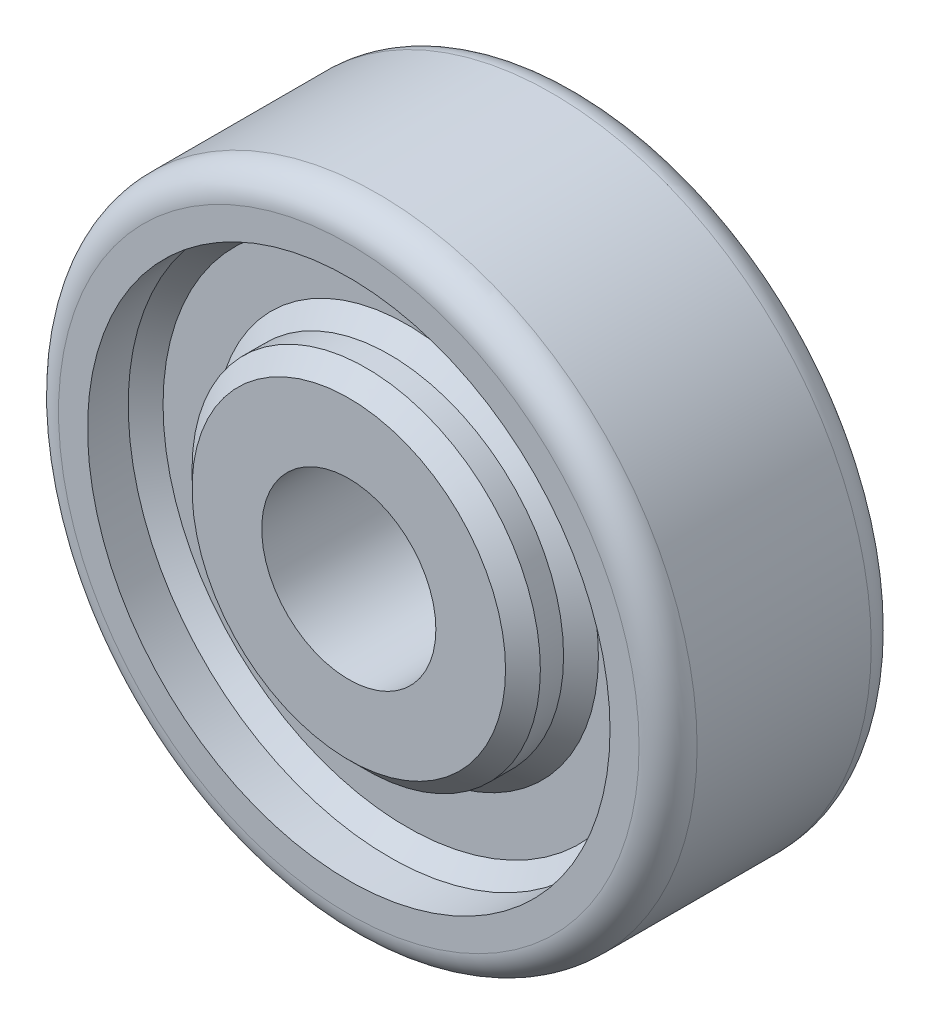
ISO-10303-21;
HEADER;
FILE_DESCRIPTION(('STEP AP214'),'2;1');
FILE_NAME('part.step','',(''),(''),'','','');
FILE_SCHEMA(('AUTOMOTIVE_DESIGN { 1 0 10303 214 1 1 1 1 }'));
ENDSEC;
DATA;
#1=APPLICATION_CONTEXT('core data for automotive mechanical design processes');
#2=APPLICATION_PROTOCOL_DEFINITION('international standard','automotive_design',2000,#1);
#3=PRODUCT_CONTEXT('',#1,'mechanical');
#4=PRODUCT('Part','Part','',(#3));
#5=PRODUCT_RELATED_PRODUCT_CATEGORY('part','',(#4));
#6=PRODUCT_DEFINITION_FORMATION('','',#4);
#7=PRODUCT_DEFINITION_CONTEXT('part definition',#1,'design');
#8=PRODUCT_DEFINITION('design','',#6,#7);
#9=PRODUCT_DEFINITION_SHAPE('','',#8);
#10=(LENGTH_UNIT() NAMED_UNIT(*) SI_UNIT(.MILLI.,.METRE.));
#11=(NAMED_UNIT(*) PLANE_ANGLE_UNIT() SI_UNIT($,.RADIAN.));
#12=(NAMED_UNIT(*) SI_UNIT($,.STERADIAN.) SOLID_ANGLE_UNIT());
#13=UNCERTAINTY_MEASURE_WITH_UNIT(LENGTH_MEASURE(1.E-05),#10,'distance_accuracy_value','');
#14=(GEOMETRIC_REPRESENTATION_CONTEXT(3) GLOBAL_UNCERTAINTY_ASSIGNED_CONTEXT((#13)) GLOBAL_UNIT_ASSIGNED_CONTEXT((#10,
#11,#12)) REPRESENTATION_CONTEXT('',''));
#15=CARTESIAN_POINT('',(0.,0.,0.));
#16=DIRECTION('',(0.,0.,1.));
#17=DIRECTION('',(1.,0.,0.));
#18=AXIS2_PLACEMENT_3D('',#15,#16,#17);
#19=CARTESIAN_POINT('',(0.,0.,20.));
#20=DIRECTION('',(0.,0.,-1.));
#21=DIRECTION('',(-1.,0.,0.));
#22=AXIS2_PLACEMENT_3D('',#19,#20,#21);
#23=CYLINDRICAL_SURFACE('',#22,55.);
#24=CARTESIAN_POINT('',(0.,0.,-15.));
#25=DIRECTION('',(0.,0.,1.));
#26=DIRECTION('',(1.,0.,0.));
#27=AXIS2_PLACEMENT_3D('',#24,#25,#26);
#28=CIRCLE('',#27,55.);
#29=CARTESIAN_POINT('',(55.,0.,-15.));
#30=VERTEX_POINT('',#29);
#31=EDGE_CURVE('E100',#30,#30,#28,.T.);
#32=ORIENTED_EDGE('',*,*,#31,.T.);
#33=EDGE_LOOP('',(#32));
#34=FACE_BOUND('',#33,.T.);
#35=CARTESIAN_POINT('',(0.,0.,15.));
#36=DIRECTION('',(0.,0.,1.));
#37=DIRECTION('',(1.,0.,0.));
#38=AXIS2_PLACEMENT_3D('',#35,#36,#37);
#39=CIRCLE('',#38,55.);
#40=CARTESIAN_POINT('',(55.,0.,15.));
#41=VERTEX_POINT('',#40);
#42=EDGE_CURVE('E104',#41,#41,#39,.F.);
#43=ORIENTED_EDGE('',*,*,#42,.T.);
#44=EDGE_LOOP('',(#43));
#45=FACE_BOUND('',#44,.T.);
#46=ADVANCED_FACE('F51',(#34,#45),#23,.T.);
#47=CARTESIAN_POINT('',(0.,0.,20.));
#48=DIRECTION('',(0.,0.,1.));
#49=DIRECTION('',(1.,0.,0.));
#50=AXIS2_PLACEMENT_3D('',#47,#48,#49);
#51=PLANE('',#50);
#52=CARTESIAN_POINT('',(0.,0.,20.));
#53=DIRECTION('',(0.,0.,1.));
#54=DIRECTION('',(1.,0.,0.));
#55=AXIS2_PLACEMENT_3D('',#52,#53,#54);
#56=CIRCLE('',#55,50.);
#57=CARTESIAN_POINT('',(50.,0.,20.));
#58=VERTEX_POINT('',#57);
#59=EDGE_CURVE('E92',#58,#58,#56,.T.);
#60=ORIENTED_EDGE('',*,*,#59,.T.);
#61=EDGE_LOOP('',(#60));
#62=FACE_BOUND('',#61,.T.);
#63=CARTESIAN_POINT('',(0.,0.,20.));
#64=DIRECTION('',(0.,0.,1.));
#65=DIRECTION('',(1.,0.,0.));
#66=AXIS2_PLACEMENT_3D('',#63,#64,#65);
#67=CIRCLE('',#66,45.);
#68=CARTESIAN_POINT('',(45.,0.,20.));
#69=VERTEX_POINT('',#68);
#70=EDGE_CURVE('E108',#69,#69,#67,.T.);
#71=ORIENTED_EDGE('',*,*,#70,.F.);
#72=EDGE_LOOP('',(#71));
#73=FACE_BOUND('',#72,.T.);
#74=ADVANCED_FACE('F141',(#62,#73),#51,.T.);
#75=CARTESIAN_POINT('',(0.,0.,-20.));
#76=DIRECTION('',(0.,0.,1.));
#77=DIRECTION('',(1.,0.,0.));
#78=AXIS2_PLACEMENT_3D('',#75,#76,#77);
#79=PLANE('',#78);
#80=CARTESIAN_POINT('',(0.,0.,-20.));
#81=DIRECTION('',(0.,0.,1.));
#82=DIRECTION('',(1.,0.,0.));
#83=AXIS2_PLACEMENT_3D('',#80,#81,#82);
#84=CIRCLE('',#83,50.);
#85=CARTESIAN_POINT('',(50.,0.,-20.));
#86=VERTEX_POINT('',#85);
#87=EDGE_CURVE('E96',#86,#86,#84,.F.);
#88=ORIENTED_EDGE('',*,*,#87,.T.);
#89=EDGE_LOOP('',(#88));
#90=FACE_BOUND('',#89,.T.);
#91=CARTESIAN_POINT('',(0.,0.,-20.));
#92=DIRECTION('',(0.,0.,1.));
#93=DIRECTION('',(1.,0.,0.));
#94=AXIS2_PLACEMENT_3D('',#91,#92,#93);
#95=CIRCLE('',#94,45.);
#96=CARTESIAN_POINT('',(45.,0.,-20.));
#97=VERTEX_POINT('',#96);
#98=EDGE_CURVE('E119',#97,#97,#95,.T.);
#99=ORIENTED_EDGE('',*,*,#98,.T.);
#100=EDGE_LOOP('',(#99));
#101=FACE_BOUND('',#100,.T.);
#102=ADVANCED_FACE('F154',(#90,#101),#79,.F.);
#103=CARTESIAN_POINT('',(0.,0.,10.));
#104=DIRECTION('',(0.,0.,1.));
#105=DIRECTION('',(1.,0.,0.));
#106=AXIS2_PLACEMENT_3D('',#103,#104,#105);
#107=CYLINDRICAL_SURFACE('',#106,45.);
#108=CARTESIAN_POINT('',(0.,0.,13.));
#109=DIRECTION('',(0.,0.,1.));
#110=DIRECTION('',(1.,0.,0.));
#111=AXIS2_PLACEMENT_3D('',#108,#109,#110);
#112=CIRCLE('',#111,45.);
#113=CARTESIAN_POINT('',(45.,0.,13.));
#114=VERTEX_POINT('',#113);
#115=EDGE_CURVE('E70',#114,#114,#112,.F.);
#116=ORIENTED_EDGE('',*,*,#115,.T.);
#117=EDGE_LOOP('',(#116));
#118=FACE_BOUND('',#117,.T.);
#119=ORIENTED_EDGE('',*,*,#70,.T.);
#120=EDGE_LOOP('',(#119));
#121=FACE_BOUND('',#120,.T.);
#122=ADVANCED_FACE('F198',(#118,#121),#107,.F.);
#123=CARTESIAN_POINT('',(0.,0.,10.));
#124=DIRECTION('',(0.,0.,1.));
#125=DIRECTION('',(1.,0.,0.));
#126=AXIS2_PLACEMENT_3D('',#123,#124,#125);
#127=PLANE('',#126);
#128=CARTESIAN_POINT('',(0.,0.,10.));
#129=DIRECTION('',(0.,0.,1.));
#130=DIRECTION('',(1.,0.,0.));
#131=AXIS2_PLACEMENT_3D('',#128,#129,#130);
#132=CIRCLE('',#131,42.);
#133=CARTESIAN_POINT('',(42.,0.,10.));
#134=VERTEX_POINT('',#133);
#135=EDGE_CURVE('E76',#134,#134,#132,.T.);
#136=ORIENTED_EDGE('',*,*,#135,.T.);
#137=EDGE_LOOP('',(#136));
#138=FACE_BOUND('',#137,.T.);
#139=CARTESIAN_POINT('',(0.,0.,10.));
#140=DIRECTION('',(0.,0.,1.));
#141=DIRECTION('',(1.,0.,0.));
#142=AXIS2_PLACEMENT_3D('',#139,#140,#141);
#143=CIRCLE('',#142,33.);
#144=CARTESIAN_POINT('',(33.,0.,10.));
#145=VERTEX_POINT('',#144);
#146=EDGE_CURVE('E80',#145,#145,#143,.F.);
#147=ORIENTED_EDGE('',*,*,#146,.T.);
#148=EDGE_LOOP('',(#147));
#149=FACE_BOUND('',#148,.T.);
#150=ADVANCED_FACE('F149',(#138,#149),#127,.T.);
#151=CARTESIAN_POINT('',(0.,0.,10.));
#152=DIRECTION('',(0.,0.,1.));
#153=DIRECTION('',(1.,0.,0.));
#154=AXIS2_PLACEMENT_3D('',#151,#152,#153);
#155=CYLINDRICAL_SURFACE('',#154,30.);
#156=CARTESIAN_POINT('',(0.,0.,13.));
#157=DIRECTION('',(0.,0.,1.));
#158=DIRECTION('',(1.,0.,0.));
#159=AXIS2_PLACEMENT_3D('',#156,#157,#158);
#160=CIRCLE('',#159,30.);
#161=CARTESIAN_POINT('',(30.,0.,13.));
#162=VERTEX_POINT('',#161);
#163=EDGE_CURVE('E60',#162,#162,#160,.T.);
#164=ORIENTED_EDGE('',*,*,#163,.T.);
#165=EDGE_LOOP('',(#164));
#166=FACE_BOUND('',#165,.T.);
#167=CARTESIAN_POINT('',(0.,0.,17.));
#168=DIRECTION('',(0.,0.,1.));
#169=DIRECTION('',(1.,0.,0.));
#170=AXIS2_PLACEMENT_3D('',#167,#168,#169);
#171=CIRCLE('',#170,30.);
#172=CARTESIAN_POINT('',(30.,0.,17.));
#173=VERTEX_POINT('',#172);
#174=EDGE_CURVE('E65',#173,#173,#171,.F.);
#175=ORIENTED_EDGE('',*,*,#174,.T.);
#176=EDGE_LOOP('',(#175));
#177=FACE_BOUND('',#176,.T.);
#178=ADVANCED_FACE('F139',(#166,#177),#155,.T.);
#179=CARTESIAN_POINT('',(0.,0.,20.));
#180=DIRECTION('',(0.,0.,1.));
#181=DIRECTION('',(1.,0.,0.));
#182=AXIS2_PLACEMENT_3D('',#179,#180,#181);
#183=CIRCLE('',#182,27.);
#184=CARTESIAN_POINT('',(27.,0.,20.));
#185=VERTEX_POINT('',#184);
#186=EDGE_CURVE('E11',#185,#185,#183,.T.);
#187=ORIENTED_EDGE('',*,*,#186,.T.);
#188=EDGE_LOOP('',(#187));
#189=FACE_BOUND('',#188,.T.);
#190=CARTESIAN_POINT('',(0.,0.,20.));
#191=DIRECTION('',(0.,0.,1.));
#192=DIRECTION('',(1.,0.,0.));
#193=AXIS2_PLACEMENT_3D('',#190,#191,#192);
#194=CIRCLE('',#193,15.);
#195=CARTESIAN_POINT('',(15.,0.,20.));
#196=VERTEX_POINT('',#195);
#197=EDGE_CURVE('E114',#196,#196,#194,.T.);
#198=ORIENTED_EDGE('',*,*,#197,.F.);
#199=EDGE_LOOP('',(#198));
#200=FACE_BOUND('',#199,.T.);
#201=ADVANCED_FACE('F136',(#189,#200),#51,.T.);
#202=CARTESIAN_POINT('',(0.,0.,-10.));
#203=DIRECTION('',(0.,0.,-1.));
#204=DIRECTION('',(1.,0.,0.));
#205=AXIS2_PLACEMENT_3D('',#202,#203,#204);
#206=PLANE('',#205);
#207=CARTESIAN_POINT('',(0.,0.,-10.));
#208=DIRECTION('',(0.,0.,1.));
#209=DIRECTION('',(1.,0.,0.));
#210=AXIS2_PLACEMENT_3D('',#207,#208,#209);
#211=CIRCLE('',#210,45.);
#212=CARTESIAN_POINT('',(45.,0.,-10.));
#213=VERTEX_POINT('',#212);
#214=EDGE_CURVE('E118',#213,#213,#211,.T.);
#215=ORIENTED_EDGE('',*,*,#214,.F.);
#216=EDGE_LOOP('',(#215));
#217=FACE_BOUND('',#216,.T.);
#218=CARTESIAN_POINT('',(0.,0.,-10.));
#219=DIRECTION('',(0.,0.,1.));
#220=DIRECTION('',(1.,0.,0.));
#221=AXIS2_PLACEMENT_3D('',#218,#219,#220);
#222=CIRCLE('',#221,30.);
#223=CARTESIAN_POINT('',(30.,0.,-10.));
#224=VERTEX_POINT('',#223);
#225=EDGE_CURVE('E113',#224,#224,#222,.T.);
#226=ORIENTED_EDGE('',*,*,#225,.T.);
#227=EDGE_LOOP('',(#226));
#228=FACE_BOUND('',#227,.T.);
#229=ADVANCED_FACE('F138',(#217,#228),#206,.T.);
#230=CARTESIAN_POINT('',(0.,0.,-10.));
#231=DIRECTION('',(0.,0.,-1.));
#232=DIRECTION('',(-1.,0.,0.));
#233=AXIS2_PLACEMENT_3D('',#230,#231,#232);
#234=CYLINDRICAL_SURFACE('',#233,45.);
#235=ORIENTED_EDGE('',*,*,#214,.T.);
#236=EDGE_LOOP('',(#235));
#237=FACE_BOUND('',#236,.T.);
#238=ORIENTED_EDGE('',*,*,#98,.F.);
#239=EDGE_LOOP('',(#238));
#240=FACE_BOUND('',#239,.T.);
#241=ADVANCED_FACE('F146',(#237,#240),#234,.F.);
#242=CARTESIAN_POINT('',(0.,0.,-10.));
#243=DIRECTION('',(0.,0.,-1.));
#244=DIRECTION('',(-1.,0.,0.));
#245=AXIS2_PLACEMENT_3D('',#242,#243,#244);
#246=CYLINDRICAL_SURFACE('',#245,30.);
#247=CARTESIAN_POINT('',(0.,0.,-17.));
#248=DIRECTION('',(0.,0.,1.));
#249=DIRECTION('',(1.,0.,0.));
#250=AXIS2_PLACEMENT_3D('',#247,#248,#249);
#251=CIRCLE('',#250,30.);
#252=CARTESIAN_POINT('',(30.,0.,-17.));
#253=VERTEX_POINT('',#252);
#254=EDGE_CURVE('E88',#253,#253,#251,.T.);
#255=ORIENTED_EDGE('',*,*,#254,.T.);
#256=EDGE_LOOP('',(#255));
#257=FACE_BOUND('',#256,.T.);
#258=ORIENTED_EDGE('',*,*,#225,.F.);
#259=EDGE_LOOP('',(#258));
#260=FACE_BOUND('',#259,.T.);
#261=ADVANCED_FACE('F207',(#257,#260),#246,.T.);
#262=CARTESIAN_POINT('',(0.,0.,-20.));
#263=DIRECTION('',(0.,0.,1.));
#264=DIRECTION('',(1.,0.,0.));
#265=AXIS2_PLACEMENT_3D('',#262,#263,#264);
#266=CIRCLE('',#265,26.9999999999999);
#267=CARTESIAN_POINT('',(26.9999999999999,0.,-20.));
#268=VERTEX_POINT('',#267);
#269=EDGE_CURVE('E84',#268,#268,#266,.F.);
#270=ORIENTED_EDGE('',*,*,#269,.T.);
#271=EDGE_LOOP('',(#270));
#272=FACE_BOUND('',#271,.T.);
#273=CARTESIAN_POINT('',(0.,0.,-20.));
#274=DIRECTION('',(0.,0.,1.));
#275=DIRECTION('',(1.,0.,0.));
#276=AXIS2_PLACEMENT_3D('',#273,#274,#275);
#277=CIRCLE('',#276,15.);
#278=CARTESIAN_POINT('',(15.,0.,-20.));
#279=VERTEX_POINT('',#278);
#280=EDGE_CURVE('E109',#279,#279,#277,.T.);
#281=ORIENTED_EDGE('',*,*,#280,.T.);
#282=EDGE_LOOP('',(#281));
#283=FACE_BOUND('',#282,.T.);
#284=ADVANCED_FACE('F212',(#272,#283),#79,.F.);
#285=CARTESIAN_POINT('',(0.,0.,-67.));
#286=DIRECTION('',(0.,0.,1.));
#287=DIRECTION('',(1.,0.,0.));
#288=AXIS2_PLACEMENT_3D('',#285,#286,#287);
#289=CYLINDRICAL_SURFACE('',#288,15.);
#290=ORIENTED_EDGE('',*,*,#197,.T.);
#291=EDGE_LOOP('',(#290));
#292=FACE_BOUND('',#291,.T.);
#293=ORIENTED_EDGE('',*,*,#280,.F.);
#294=EDGE_LOOP('',(#293));
#295=FACE_BOUND('',#294,.T.);
#296=ADVANCED_FACE('F133',(#292,#295),#289,.F.);
#297=CARTESIAN_POINT('',(0.,0.,-15.));
#298=DIRECTION('',(0.,0.,1.));
#299=DIRECTION('',(1.,0.,0.));
#300=AXIS2_PLACEMENT_3D('',#297,#298,#299);
#301=TOROIDAL_SURFACE('',#300,50.,5.);
#302=ORIENTED_EDGE('',*,*,#87,.F.);
#303=EDGE_LOOP('',(#302));
#304=FACE_BOUND('',#303,.T.);
#305=ORIENTED_EDGE('',*,*,#31,.F.);
#306=EDGE_LOOP('',(#305));
#307=FACE_BOUND('',#306,.T.);
#308=ADVANCED_FACE('F163',(#304,#307),#301,.T.);
#309=CARTESIAN_POINT('',(0.,0.,15.));
#310=DIRECTION('',(0.,0.,1.));
#311=DIRECTION('',(1.,0.,0.));
#312=AXIS2_PLACEMENT_3D('',#309,#310,#311);
#313=TOROIDAL_SURFACE('',#312,50.,5.);
#314=ORIENTED_EDGE('',*,*,#42,.F.);
#315=EDGE_LOOP('',(#314));
#316=FACE_BOUND('',#315,.T.);
#317=ORIENTED_EDGE('',*,*,#59,.F.);
#318=EDGE_LOOP('',(#317));
#319=FACE_BOUND('',#318,.T.);
#320=ADVANCED_FACE('F166',(#316,#319),#313,.T.);
#321=CARTESIAN_POINT('',(0.,0.,-17.));
#322=DIRECTION('',(0.,0.,1.));
#323=DIRECTION('',(1.,0.,0.));
#324=AXIS2_PLACEMENT_3D('',#321,#322,#323);
#325=CONICAL_SURFACE('',#324,30.,0.785398163397452);
#326=ORIENTED_EDGE('',*,*,#269,.F.);
#327=EDGE_LOOP('',(#326));
#328=FACE_BOUND('',#327,.T.);
#329=ORIENTED_EDGE('',*,*,#254,.F.);
#330=EDGE_LOOP('',(#329));
#331=FACE_BOUND('',#330,.T.);
#332=ADVANCED_FACE('F170',(#328,#331),#325,.T.);
#333=CARTESIAN_POINT('',(0.,0.,10.));
#334=DIRECTION('',(0.,0.,1.));
#335=DIRECTION('',(1.,0.,0.));
#336=AXIS2_PLACEMENT_3D('',#333,#334,#335);
#337=CONICAL_SURFACE('',#336,42.,0.785398163397457);
#338=ORIENTED_EDGE('',*,*,#115,.F.);
#339=EDGE_LOOP('',(#338));
#340=FACE_BOUND('',#339,.T.);
#341=ORIENTED_EDGE('',*,*,#135,.F.);
#342=EDGE_LOOP('',(#341));
#343=FACE_BOUND('',#342,.T.);
#344=ADVANCED_FACE('F178',(#340,#343),#337,.F.);
#345=CARTESIAN_POINT('',(0.,0.,13.));
#346=DIRECTION('',(0.,0.,-1.));
#347=DIRECTION('',(-1.,0.,0.));
#348=AXIS2_PLACEMENT_3D('',#345,#346,#347);
#349=CONICAL_SURFACE('',#348,30.,0.785398163397443);
#350=ORIENTED_EDGE('',*,*,#146,.F.);
#351=EDGE_LOOP('',(#350));
#352=FACE_BOUND('',#351,.T.);
#353=ORIENTED_EDGE('',*,*,#163,.F.);
#354=EDGE_LOOP('',(#353));
#355=FACE_BOUND('',#354,.T.);
#356=ADVANCED_FACE('F184',(#352,#355),#349,.T.);
#357=CARTESIAN_POINT('',(0.,0.,20.));
#358=DIRECTION('',(0.,0.,-1.));
#359=DIRECTION('',(-1.,0.,0.));
#360=AXIS2_PLACEMENT_3D('',#357,#358,#359);
#361=CONICAL_SURFACE('',#360,27.,0.785398163397448);
#362=ORIENTED_EDGE('',*,*,#174,.F.);
#363=EDGE_LOOP('',(#362));
#364=FACE_BOUND('',#363,.T.);
#365=ORIENTED_EDGE('',*,*,#186,.F.);
#366=EDGE_LOOP('',(#365));
#367=FACE_BOUND('',#366,.T.);
#368=ADVANCED_FACE('F54',(#364,#367),#361,.T.);
#369=CLOSED_SHELL('',(#46,#74,#102,#122,#150,#178,#201,#229,#241,#261,#284,#296,#308,#320,#332,
#344,#356,#368));
#370=MANIFOLD_SOLID_BREP('B2',#369);
#371=ADVANCED_BREP_SHAPE_REPRESENTATION('',(#18,#370),#14);
#372=SHAPE_DEFINITION_REPRESENTATION(#9,#371);
ENDSEC;
END-ISO-10303-21;
